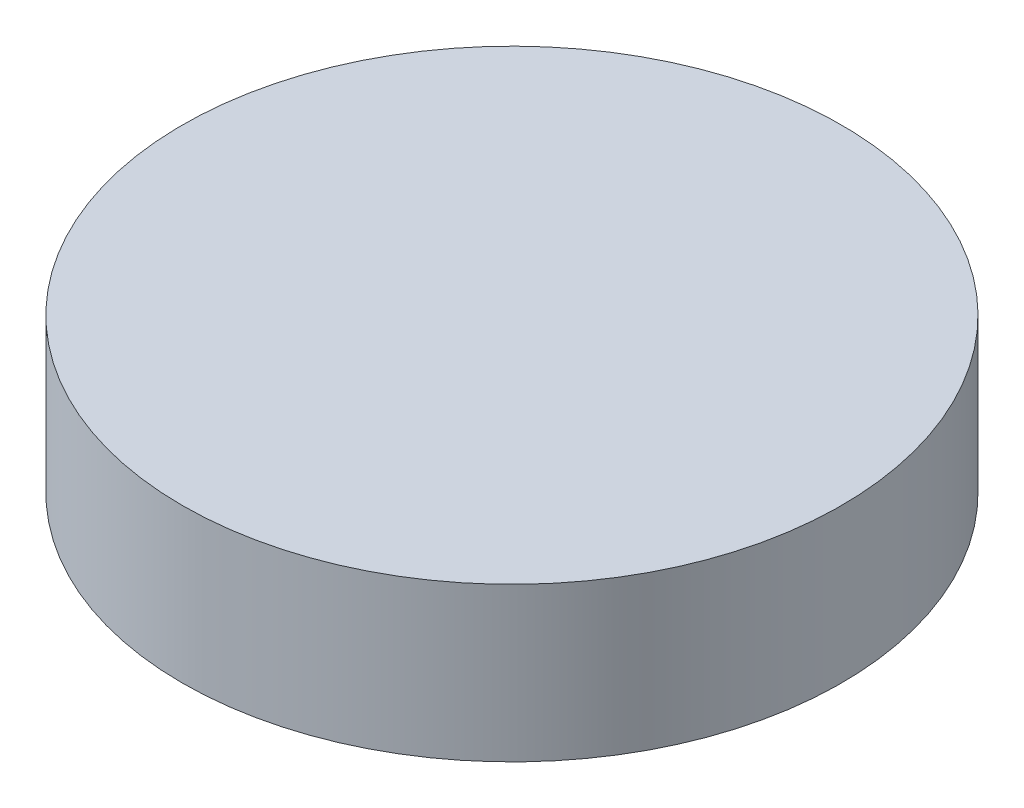
ISO-10303-21;
HEADER;
FILE_DESCRIPTION(('STEP AP214'),'2;1');
FILE_NAME('part.step','',(''),(''),'','','');
FILE_SCHEMA(('AUTOMOTIVE_DESIGN { 1 0 10303 214 1 1 1 1 }'));
ENDSEC;
DATA;
#1=APPLICATION_CONTEXT('core data for automotive mechanical design processes');
#2=APPLICATION_PROTOCOL_DEFINITION('international standard','automotive_design',2000,#1);
#3=PRODUCT_CONTEXT('',#1,'mechanical');
#4=PRODUCT('Part','Part','',(#3));
#5=PRODUCT_RELATED_PRODUCT_CATEGORY('part','',(#4));
#6=PRODUCT_DEFINITION_FORMATION('','',#4);
#7=PRODUCT_DEFINITION_CONTEXT('part definition',#1,'design');
#8=PRODUCT_DEFINITION('design','',#6,#7);
#9=PRODUCT_DEFINITION_SHAPE('','',#8);
#10=(LENGTH_UNIT() NAMED_UNIT(*) SI_UNIT(.MILLI.,.METRE.));
#11=(NAMED_UNIT(*) PLANE_ANGLE_UNIT() SI_UNIT($,.RADIAN.));
#12=(NAMED_UNIT(*) SI_UNIT($,.STERADIAN.) SOLID_ANGLE_UNIT());
#13=UNCERTAINTY_MEASURE_WITH_UNIT(LENGTH_MEASURE(1.E-05),#10,'distance_accuracy_value','');
#14=(GEOMETRIC_REPRESENTATION_CONTEXT(3) GLOBAL_UNCERTAINTY_ASSIGNED_CONTEXT((#13)) GLOBAL_UNIT_ASSIGNED_CONTEXT((#10,
#11,#12)) REPRESENTATION_CONTEXT('',''));
#15=CARTESIAN_POINT('',(0.,0.,0.));
#16=DIRECTION('',(0.,0.,1.));
#17=DIRECTION('',(1.,0.,0.));
#18=AXIS2_PLACEMENT_3D('',#15,#16,#17);
#19=CARTESIAN_POINT('',(0.,17.5,0.));
#20=DIRECTION('',(0.,-1.,0.));
#21=DIRECTION('',(0.,0.,-1.));
#22=AXIS2_PLACEMENT_3D('',#19,#20,#21);
#23=CYLINDRICAL_SURFACE('',#22,75.);
#24=CARTESIAN_POINT('',(0.,17.5,0.));
#25=DIRECTION('',(0.,1.,0.));
#26=DIRECTION('',(0.,0.,1.));
#27=AXIS2_PLACEMENT_3D('',#24,#25,#26);
#28=CIRCLE('',#27,75.);
#29=CARTESIAN_POINT('',(0.,17.5,75.));
#30=VERTEX_POINT('',#29);
#31=EDGE_CURVE('E10',#30,#30,#28,.T.);
#32=ORIENTED_EDGE('',*,*,#31,.F.);
#33=EDGE_LOOP('',(#32));
#34=FACE_BOUND('',#33,.T.);
#35=CARTESIAN_POINT('',(0.,-17.5,0.));
#36=DIRECTION('',(0.,1.,0.));
#37=DIRECTION('',(0.,0.,1.));
#38=AXIS2_PLACEMENT_3D('',#35,#36,#37);
#39=CIRCLE('',#38,75.);
#40=CARTESIAN_POINT('',(0.,-17.5,75.));
#41=VERTEX_POINT('',#40);
#42=EDGE_CURVE('E40',#41,#41,#39,.T.);
#43=ORIENTED_EDGE('',*,*,#42,.T.);
#44=EDGE_LOOP('',(#43));
#45=FACE_BOUND('',#44,.T.);
#46=ADVANCED_FACE('F37',(#34,#45),#23,.T.);
#47=CARTESIAN_POINT('',(0.,17.5,0.));
#48=DIRECTION('',(0.,1.,0.));
#49=DIRECTION('',(0.,0.,1.));
#50=AXIS2_PLACEMENT_3D('',#47,#48,#49);
#51=PLANE('',#50);
#52=ORIENTED_EDGE('',*,*,#31,.T.);
#53=EDGE_LOOP('',(#52));
#54=FACE_BOUND('',#53,.T.);
#55=ADVANCED_FACE('F54',(#54),#51,.T.);
#56=CARTESIAN_POINT('',(0.,-17.5,0.));
#57=DIRECTION('',(0.,1.,0.));
#58=DIRECTION('',(0.,0.,1.));
#59=AXIS2_PLACEMENT_3D('',#56,#57,#58);
#60=PLANE('',#59);
#61=ORIENTED_EDGE('',*,*,#42,.F.);
#62=EDGE_LOOP('',(#61));
#63=FACE_BOUND('',#62,.T.);
#64=ADVANCED_FACE('F52',(#63),#60,.F.);
#65=CLOSED_SHELL('',(#46,#55,#64));
#66=MANIFOLD_SOLID_BREP('B2',#65);
#67=ADVANCED_BREP_SHAPE_REPRESENTATION('',(#18,#66),#14);
#68=SHAPE_DEFINITION_REPRESENTATION(#9,#67);
ENDSEC;
END-ISO-10303-21;
